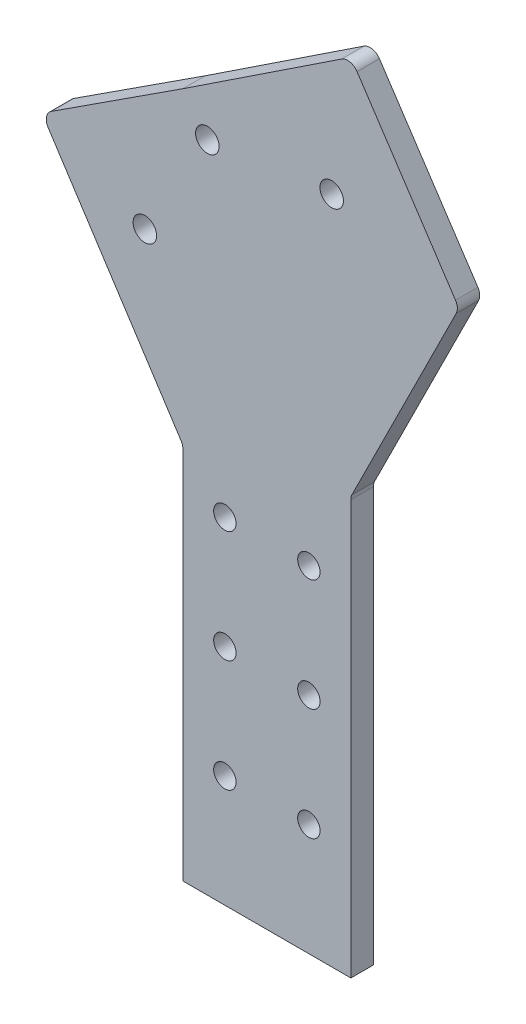
ISO-10303-21;
HEADER;
FILE_DESCRIPTION(('STEP AP214'),'2;1');
FILE_NAME('part.step','',(''),(''),'','','');
FILE_SCHEMA(('AUTOMOTIVE_DESIGN { 1 0 10303 214 1 1 1 1 }'));
ENDSEC;
DATA;
#1=APPLICATION_CONTEXT('core data for automotive mechanical design processes');
#2=APPLICATION_PROTOCOL_DEFINITION('international standard','automotive_design',2000,#1);
#3=PRODUCT_CONTEXT('',#1,'mechanical');
#4=PRODUCT('Part','Part','',(#3));
#5=PRODUCT_RELATED_PRODUCT_CATEGORY('part','',(#4));
#6=PRODUCT_DEFINITION_FORMATION('','',#4);
#7=PRODUCT_DEFINITION_CONTEXT('part definition',#1,'design');
#8=PRODUCT_DEFINITION('design','',#6,#7);
#9=PRODUCT_DEFINITION_SHAPE('','',#8);
#10=(LENGTH_UNIT() NAMED_UNIT(*) SI_UNIT(.MILLI.,.METRE.));
#11=(NAMED_UNIT(*) PLANE_ANGLE_UNIT() SI_UNIT($,.RADIAN.));
#12=(NAMED_UNIT(*) SI_UNIT($,.STERADIAN.) SOLID_ANGLE_UNIT());
#13=UNCERTAINTY_MEASURE_WITH_UNIT(LENGTH_MEASURE(1.E-05),#10,'distance_accuracy_value','');
#14=(GEOMETRIC_REPRESENTATION_CONTEXT(3) GLOBAL_UNCERTAINTY_ASSIGNED_CONTEXT((#13)) GLOBAL_UNIT_ASSIGNED_CONTEXT((#10,
#11,#12)) REPRESENTATION_CONTEXT('',''));
#15=CARTESIAN_POINT('',(0.,0.,0.));
#16=DIRECTION('',(0.,0.,1.));
#17=DIRECTION('',(1.,0.,0.));
#18=AXIS2_PLACEMENT_3D('',#15,#16,#17);
#19=CARTESIAN_POINT('',(-30.,-100.,4.));
#20=DIRECTION('',(1.,0.,0.));
#21=DIRECTION('',(0.,0.,-1.));
#22=AXIS2_PLACEMENT_3D('',#19,#20,#21);
#23=PLANE('',#22);
#24=DIRECTION('',(0.,-1.,0.));
#25=VECTOR('',#24,1.);
#26=CARTESIAN_POINT('',(-30.,-100.,4.));
#27=LINE('',#26,#25);
#28=CARTESIAN_POINT('',(-30.,-33.1570085491493,4.));
#29=VERTEX_POINT('',#28);
#30=CARTESIAN_POINT('',(-30.,-100.,4.));
#31=VERTEX_POINT('',#30);
#32=EDGE_CURVE('E147',#29,#31,#27,.T.);
#33=ORIENTED_EDGE('',*,*,#32,.F.);
#34=DIRECTION('',(0.,0.,1.));
#35=VECTOR('',#34,1.);
#36=CARTESIAN_POINT('',(-30.,-33.1570085491493,4.));
#37=LINE('',#36,#35);
#38=CARTESIAN_POINT('',(-30.,-33.1570085491493,0.));
#39=VERTEX_POINT('',#38);
#40=EDGE_CURVE('E251',#29,#39,#37,.F.);
#41=ORIENTED_EDGE('',*,*,#40,.T.);
#42=DIRECTION('',(0.,-1.,0.));
#43=VECTOR('',#42,1.);
#44=CARTESIAN_POINT('',(-30.,-100.,0.));
#45=LINE('',#44,#43);
#46=CARTESIAN_POINT('',(-30.,-100.,0.));
#47=VERTEX_POINT('',#46);
#48=EDGE_CURVE('E223',#39,#47,#45,.T.);
#49=ORIENTED_EDGE('',*,*,#48,.T.);
#50=DIRECTION('',(0.,0.,-1.));
#51=VECTOR('',#50,1.);
#52=CARTESIAN_POINT('',(-30.,-100.,4.));
#53=LINE('',#52,#51);
#54=EDGE_CURVE('E158',#31,#47,#53,.T.);
#55=ORIENTED_EDGE('',*,*,#54,.F.);
#56=EDGE_LOOP('',(#33,#41,#49,#55));
#57=FACE_BOUND('',#56,.T.);
#58=ADVANCED_FACE('F41',(#57),#23,.F.);
#59=CARTESIAN_POINT('',(-30.,22.5177722040746,4.));
#60=DIRECTION('',(0.551936985312062,-0.833885822067166,0.));
#61=DIRECTION('',(0.833885822067166,0.551936985312062,0.));
#62=AXIS2_PLACEMENT_3D('',#59,#60,#61);
#63=PLANE('',#62);
#64=DIRECTION('',(-0.833885822067166,-0.551936985312062,0.));
#65=VECTOR('',#64,1.);
#66=CARTESIAN_POINT('',(-30.,22.5177722040746,4.));
#67=LINE('',#66,#65);
#68=CARTESIAN_POINT('',(-1.66777164413434,41.2704650693214,4.));
#69=VERTEX_POINT('',#68);
#70=CARTESIAN_POINT('',(-30.,22.5177722040746,4.));
#71=VERTEX_POINT('',#70);
#72=EDGE_CURVE('E136',#69,#71,#67,.T.);
#73=ORIENTED_EDGE('',*,*,#72,.F.);
#74=DIRECTION('',(0.,0.,-1.));
#75=VECTOR('',#74,1.);
#76=CARTESIAN_POINT('',(-1.66777164413433,41.2704650693214,0.));
#77=LINE('',#76,#75);
#78=CARTESIAN_POINT('',(-1.66777164413434,41.2704650693214,0.));
#79=VERTEX_POINT('',#78);
#80=EDGE_CURVE('E267',#69,#79,#77,.T.);
#81=ORIENTED_EDGE('',*,*,#80,.T.);
#82=DIRECTION('',(-0.833885822067166,-0.551936985312062,0.));
#83=VECTOR('',#82,1.);
#84=CARTESIAN_POINT('',(-30.,22.5177722040746,0.));
#85=LINE('',#84,#83);
#86=CARTESIAN_POINT('',(-30.,22.5177722040746,0.));
#87=VERTEX_POINT('',#86);
#88=EDGE_CURVE('E153',#79,#87,#85,.T.);
#89=ORIENTED_EDGE('',*,*,#88,.T.);
#90=DIRECTION('',(0.,0.,-1.));
#91=VECTOR('',#90,1.);
#92=CARTESIAN_POINT('',(-30.,22.5177722040746,4.));
#93=LINE('',#92,#91);
#94=EDGE_CURVE('E151',#71,#87,#93,.T.);
#95=ORIENTED_EDGE('',*,*,#94,.F.);
#96=EDGE_LOOP('',(#73,#81,#89,#95));
#97=FACE_BOUND('',#96,.T.);
#98=ADVANCED_FACE('F152',(#97),#63,.F.);
#99=CARTESIAN_POINT('',(-30.,-100.,4.));
#100=DIRECTION('',(0.,1.,0.));
#101=DIRECTION('',(0.,0.,1.));
#102=AXIS2_PLACEMENT_3D('',#99,#100,#101);
#103=PLANE('',#102);
#104=DIRECTION('',(1.,0.,0.));
#105=VECTOR('',#104,1.);
#106=CARTESIAN_POINT('',(-30.,-100.,0.));
#107=LINE('',#106,#105);
#108=CARTESIAN_POINT('',(0.,-100.,0.));
#109=VERTEX_POINT('',#108);
#110=EDGE_CURVE('E225',#47,#109,#107,.T.);
#111=ORIENTED_EDGE('',*,*,#110,.T.);
#112=DIRECTION('',(0.,0.,-1.));
#113=VECTOR('',#112,1.);
#114=CARTESIAN_POINT('',(0.,-100.,4.));
#115=LINE('',#114,#113);
#116=CARTESIAN_POINT('',(0.,-100.,4.));
#117=VERTEX_POINT('',#116);
#118=EDGE_CURVE('E221',#117,#109,#115,.T.);
#119=ORIENTED_EDGE('',*,*,#118,.F.);
#120=DIRECTION('',(1.,0.,0.));
#121=VECTOR('',#120,1.);
#122=CARTESIAN_POINT('',(-30.,-100.,4.));
#123=LINE('',#122,#121);
#124=EDGE_CURVE('E218',#31,#117,#123,.T.);
#125=ORIENTED_EDGE('',*,*,#124,.F.);
#126=ORIENTED_EDGE('',*,*,#54,.T.);
#127=EDGE_LOOP('',(#111,#119,#125,#126));
#128=FACE_BOUND('',#127,.T.);
#129=ADVANCED_FACE('F309',(#128),#103,.F.);
#130=CARTESIAN_POINT('',(0.,-100.,4.));
#131=DIRECTION('',(-1.,0.,0.));
#132=DIRECTION('',(0.,0.,1.));
#133=AXIS2_PLACEMENT_3D('',#130,#131,#132);
#134=PLANE('',#133);
#135=DIRECTION('',(0.,1.,0.));
#136=VECTOR('',#135,1.);
#137=CARTESIAN_POINT('',(0.,-100.,0.));
#138=LINE('',#137,#136);
#139=CARTESIAN_POINT('',(0.,-26.0281038060491,0.));
#140=VERTEX_POINT('',#139);
#141=EDGE_CURVE('E215',#109,#140,#138,.T.);
#142=ORIENTED_EDGE('',*,*,#141,.T.);
#143=DIRECTION('',(0.,0.,1.));
#144=VECTOR('',#143,1.);
#145=CARTESIAN_POINT('',(0.,-26.0281038060491,4.));
#146=LINE('',#145,#144);
#147=CARTESIAN_POINT('',(0.,-26.0281038060491,4.));
#148=VERTEX_POINT('',#147);
#149=EDGE_CURVE('E157',#140,#148,#146,.T.);
#150=ORIENTED_EDGE('',*,*,#149,.T.);
#151=DIRECTION('',(0.,1.,0.));
#152=VECTOR('',#151,1.);
#153=CARTESIAN_POINT('',(0.,42.3743390399456,4.));
#154=LINE('',#153,#152);
#155=EDGE_CURVE('E148',#117,#148,#154,.T.);
#156=ORIENTED_EDGE('',*,*,#155,.F.);
#157=ORIENTED_EDGE('',*,*,#118,.T.);
#158=EDGE_LOOP('',(#142,#150,#156,#157));
#159=FACE_BOUND('',#158,.T.);
#160=ADVANCED_FACE('F331',(#159),#134,.F.);
#161=CARTESIAN_POINT('',(0.,0.,4.));
#162=DIRECTION('',(0.,0.,1.));
#163=DIRECTION('',(1.,0.,0.));
#164=AXIS2_PLACEMENT_3D('',#161,#162,#163);
#165=PLANE('',#164);
#166=CARTESIAN_POINT('',(-3.42993826182382,19.4978801372106,4.));
#167=DIRECTION('',(0.,0.,1.));
#168=DIRECTION('',(1.,0.,0.));
#169=AXIS2_PLACEMENT_3D('',#166,#167,#168);
#170=CIRCLE('',#169,2.10000000003924);
#171=CARTESIAN_POINT('',(-1.32993826178458,19.4978801372106,4.));
#172=VERTEX_POINT('',#171);
#173=EDGE_CURVE('E236',#172,#172,#170,.T.);
#174=ORIENTED_EDGE('',*,*,#173,.F.);
#175=EDGE_LOOP('',(#174));
#176=FACE_BOUND('',#175,.T.);
#177=CARTESIAN_POINT('',(-25.6270245562886,16.7979986516404,4.));
#178=DIRECTION('',(0.,0.,1.));
#179=DIRECTION('',(1.,0.,0.));
#180=AXIS2_PLACEMENT_3D('',#177,#178,#179);
#181=CIRCLE('',#180,2.10000000004027);
#182=CARTESIAN_POINT('',(-23.5270245562484,16.7979986516404,4.));
#183=VERTEX_POINT('',#182);
#184=EDGE_CURVE('E347',#183,#183,#181,.T.);
#185=ORIENTED_EDGE('',*,*,#184,.F.);
#186=EDGE_LOOP('',(#185));
#187=FACE_BOUND('',#186,.T.);
#188=CARTESIAN_POINT('',(-36.7853711445104,-2.57959927527192,4.));
#189=DIRECTION('',(0.,0.,1.));
#190=DIRECTION('',(1.,0.,0.));
#191=AXIS2_PLACEMENT_3D('',#188,#189,#190);
#192=CIRCLE('',#191,2.10000000003922);
#193=CARTESIAN_POINT('',(-34.6853711444712,-2.57959927527192,4.));
#194=VERTEX_POINT('',#193);
#195=EDGE_CURVE('E349',#194,#194,#192,.T.);
#196=ORIENTED_EDGE('',*,*,#195,.F.);
#197=EDGE_LOOP('',(#196));
#198=FACE_BOUND('',#197,.T.);
#199=CARTESIAN_POINT('',(-22.4999999999998,-60.,4.));
#200=DIRECTION('',(0.,0.,1.));
#201=DIRECTION('',(1.,0.,0.));
#202=AXIS2_PLACEMENT_3D('',#199,#200,#201);
#203=CIRCLE('',#202,2.);
#204=CARTESIAN_POINT('',(-20.4999999999998,-60.,4.));
#205=VERTEX_POINT('',#204);
#206=EDGE_CURVE('E189',#205,#205,#203,.T.);
#207=ORIENTED_EDGE('',*,*,#206,.F.);
#208=EDGE_LOOP('',(#207));
#209=FACE_BOUND('',#208,.T.);
#210=CARTESIAN_POINT('',(-7.49999999999959,-80.,4.));
#211=DIRECTION('',(0.,0.,1.));
#212=DIRECTION('',(1.,0.,0.));
#213=AXIS2_PLACEMENT_3D('',#210,#211,#212);
#214=CIRCLE('',#213,2.);
#215=CARTESIAN_POINT('',(-5.49999999999959,-80.,4.));
#216=VERTEX_POINT('',#215);
#217=EDGE_CURVE('E188',#216,#216,#214,.T.);
#218=ORIENTED_EDGE('',*,*,#217,.F.);
#219=EDGE_LOOP('',(#218));
#220=FACE_BOUND('',#219,.T.);
#221=CARTESIAN_POINT('',(-7.4999999999998,-60.,4.));
#222=DIRECTION('',(0.,0.,1.));
#223=DIRECTION('',(1.,0.,0.));
#224=AXIS2_PLACEMENT_3D('',#221,#222,#223);
#225=CIRCLE('',#224,2.);
#226=CARTESIAN_POINT('',(-5.49999999999979,-60.,4.));
#227=VERTEX_POINT('',#226);
#228=EDGE_CURVE('E201',#227,#227,#225,.T.);
#229=ORIENTED_EDGE('',*,*,#228,.F.);
#230=EDGE_LOOP('',(#229));
#231=FACE_BOUND('',#230,.T.);
#232=CARTESIAN_POINT('',(-7.50000000000001,-40.,4.));
#233=DIRECTION('',(0.,0.,1.));
#234=DIRECTION('',(1.,0.,0.));
#235=AXIS2_PLACEMENT_3D('',#232,#233,#234);
#236=CIRCLE('',#235,2.);
#237=CARTESIAN_POINT('',(-5.5,-40.,4.));
#238=VERTEX_POINT('',#237);
#239=EDGE_CURVE('E200',#238,#238,#236,.T.);
#240=ORIENTED_EDGE('',*,*,#239,.F.);
#241=EDGE_LOOP('',(#240));
#242=FACE_BOUND('',#241,.T.);
#243=CARTESIAN_POINT('',(-22.4999999999996,-80.,4.));
#244=DIRECTION('',(0.,0.,1.));
#245=DIRECTION('',(1.,0.,0.));
#246=AXIS2_PLACEMENT_3D('',#243,#244,#245);
#247=CIRCLE('',#246,2.);
#248=CARTESIAN_POINT('',(-20.4999999999996,-80.,4.));
#249=VERTEX_POINT('',#248);
#250=EDGE_CURVE('E181',#249,#249,#247,.T.);
#251=ORIENTED_EDGE('',*,*,#250,.F.);
#252=EDGE_LOOP('',(#251));
#253=FACE_BOUND('',#252,.T.);
#254=CARTESIAN_POINT('',(-22.5,-40.,4.));
#255=DIRECTION('',(0.,0.,1.));
#256=DIRECTION('',(1.,0.,0.));
#257=AXIS2_PLACEMENT_3D('',#254,#255,#256);
#258=CIRCLE('',#257,2.);
#259=CARTESIAN_POINT('',(-20.5,-40.,4.));
#260=VERTEX_POINT('',#259);
#261=EDGE_CURVE('E204',#260,#260,#258,.T.);
#262=ORIENTED_EDGE('',*,*,#261,.F.);
#263=EDGE_LOOP('',(#262));
#264=FACE_BOUND('',#263,.T.);
#265=DIRECTION('',(-0.838670567945423,-0.544639035015029,0.));
#266=VECTOR('',#265,1.);
#267=CARTESIAN_POINT('',(-30.,22.5177722040746,4.));
#268=LINE('',#267,#266);
#269=CARTESIAN_POINT('',(-53.4827759024718,7.2678792236538,4.));
#270=VERTEX_POINT('',#269);
#271=EDGE_CURVE('E140',#71,#270,#268,.T.);
#272=ORIENTED_EDGE('',*,*,#271,.T.);
#273=CARTESIAN_POINT('',(-52.3934978324418,5.59053808776296,4.));
#274=DIRECTION('',(0.,0.,1.));
#275=DIRECTION('',(1.,0.,0.));
#276=AXIS2_PLACEMENT_3D('',#273,#274,#275);
#277=CIRCLE('',#276,2.);
#278=CARTESIAN_POINT('',(-54.0708389683326,4.5012600177329,4.));
#279=VERTEX_POINT('',#278);
#280=EDGE_CURVE('E257',#270,#279,#277,.T.);
#281=ORIENTED_EDGE('',*,*,#280,.T.);
#282=DIRECTION('',(0.544639035015029,-0.838670567945423,0.));
#283=VECTOR('',#282,1.);
#284=CARTESIAN_POINT('',(-55.1601170383627,6.17860115362375,4.));
#285=LINE('',#284,#283);
#286=CARTESIAN_POINT('',(-30.3226588641091,-32.0677304791192,4.));
#287=VERTEX_POINT('',#286);
#288=EDGE_CURVE('E164',#279,#287,#285,.T.);
#289=ORIENTED_EDGE('',*,*,#288,.T.);
#290=CARTESIAN_POINT('',(-32.,-33.1570085491493,4.));
#291=DIRECTION('',(0.,0.,1.));
#292=DIRECTION('',(1.,0.,0.));
#293=AXIS2_PLACEMENT_3D('',#290,#291,#292);
#294=CIRCLE('',#293,2.);
#295=EDGE_CURVE('E49',#287,#29,#294,.F.);
#296=ORIENTED_EDGE('',*,*,#295,.T.);
#297=ORIENTED_EDGE('',*,*,#32,.T.);
#298=ORIENTED_EDGE('',*,*,#124,.T.);
#299=ORIENTED_EDGE('',*,*,#155,.T.);
#300=CARTESIAN_POINT('',(2.,-26.0281038060491,4.));
#301=DIRECTION('',(0.,0.,1.));
#302=DIRECTION('',(1.,0.,0.));
#303=AXIS2_PLACEMENT_3D('',#300,#301,#302);
#304=CIRCLE('',#303,2.);
#305=CARTESIAN_POINT('',(0.210131276795943,-25.1357081798295,4.));
#306=VERTEX_POINT('',#305);
#307=EDGE_CURVE('E269',#148,#306,#304,.F.);
#308=ORIENTED_EDGE('',*,*,#307,.T.);
#309=DIRECTION('',(0.446197813109806,0.894934361602026,0.));
#310=VECTOR('',#309,1.);
#311=CARTESIAN_POINT('',(19.3177944859222,13.1883352675948,4.));
#312=LINE('',#311,#310);
#313=CARTESIAN_POINT('',(18.8025696309006,12.1549540784388,4.));
#314=VERTEX_POINT('',#313);
#315=EDGE_CURVE('E336',#306,#314,#312,.T.);
#316=ORIENTED_EDGE('',*,*,#315,.T.);
#317=CARTESIAN_POINT('',(17.0127009076966,13.0473497046584,4.));
#318=DIRECTION('',(0.,0.,1.));
#319=DIRECTION('',(1.,0.,0.));
#320=AXIS2_PLACEMENT_3D('',#317,#318,#319);
#321=CIRCLE('',#320,2.);
#322=CARTESIAN_POINT('',(18.6804725518309,14.1512236752825,4.));
#323=VERTEX_POINT('',#322);
#324=EDGE_CURVE('E255',#314,#323,#321,.T.);
#325=ORIENTED_EDGE('',*,*,#324,.T.);
#326=DIRECTION('',(-0.551936985312062,0.833885822067165,0.));
#327=VECTOR('',#326,1.);
#328=CARTESIAN_POINT('',(0.,42.3743390399456,4.));
#329=LINE('',#328,#327);
#330=CARTESIAN_POINT('',(1.10387397062412,40.7065673958112,4.));
#331=VERTEX_POINT('',#330);
#332=EDGE_CURVE('E338',#323,#331,#329,.T.);
#333=ORIENTED_EDGE('',*,*,#332,.T.);
#334=CARTESIAN_POINT('',(-0.563897673510207,39.6026934251871,4.));
#335=DIRECTION('',(0.,0.,1.));
#336=DIRECTION('',(1.,0.,0.));
#337=AXIS2_PLACEMENT_3D('',#334,#335,#336);
#338=CIRCLE('',#337,2.);
#339=EDGE_CURVE('E143',#331,#69,#338,.T.);
#340=ORIENTED_EDGE('',*,*,#339,.T.);
#341=ORIENTED_EDGE('',*,*,#72,.T.);
#342=EDGE_LOOP('',(#272,#281,#289,#296,#297,#298,#299,#308,#316,#325,#333,#340,#341));
#343=FACE_BOUND('',#342,.T.);
#344=ADVANCED_FACE('F138',(#176,#187,#198,#209,#220,#231,#242,#253,#264,#343),#165,.T.);
#345=CARTESIAN_POINT('',(0.,0.,0.));
#346=DIRECTION('',(0.,0.,1.));
#347=DIRECTION('',(1.,0.,0.));
#348=AXIS2_PLACEMENT_3D('',#345,#346,#347);
#349=PLANE('',#348);
#350=CARTESIAN_POINT('',(-3.42993826182382,19.4978801372106,0.));
#351=DIRECTION('',(0.,0.,1.));
#352=DIRECTION('',(1.,0.,0.));
#353=AXIS2_PLACEMENT_3D('',#350,#351,#352);
#354=CIRCLE('',#353,2.10000000003924);
#355=CARTESIAN_POINT('',(-1.32993826178458,19.4978801372106,0.));
#356=VERTEX_POINT('',#355);
#357=EDGE_CURVE('E165',#356,#356,#354,.T.);
#358=ORIENTED_EDGE('',*,*,#357,.T.);
#359=EDGE_LOOP('',(#358));
#360=FACE_BOUND('',#359,.T.);
#361=CARTESIAN_POINT('',(-25.6270245562886,16.7979986516404,0.));
#362=DIRECTION('',(0.,0.,1.));
#363=DIRECTION('',(1.,0.,0.));
#364=AXIS2_PLACEMENT_3D('',#361,#362,#363);
#365=CIRCLE('',#364,2.10000000004027);
#366=CARTESIAN_POINT('',(-23.5270245562484,16.7979986516404,0.));
#367=VERTEX_POINT('',#366);
#368=EDGE_CURVE('E171',#367,#367,#365,.T.);
#369=ORIENTED_EDGE('',*,*,#368,.T.);
#370=EDGE_LOOP('',(#369));
#371=FACE_BOUND('',#370,.T.);
#372=CARTESIAN_POINT('',(-36.7853711445104,-2.57959927527192,0.));
#373=DIRECTION('',(0.,0.,1.));
#374=DIRECTION('',(1.,0.,0.));
#375=AXIS2_PLACEMENT_3D('',#372,#373,#374);
#376=CIRCLE('',#375,2.10000000003922);
#377=CARTESIAN_POINT('',(-34.6853711444712,-2.57959927527192,0.));
#378=VERTEX_POINT('',#377);
#379=EDGE_CURVE('E233',#378,#378,#376,.T.);
#380=ORIENTED_EDGE('',*,*,#379,.T.);
#381=EDGE_LOOP('',(#380));
#382=FACE_BOUND('',#381,.T.);
#383=CARTESIAN_POINT('',(-22.4999999999998,-60.,0.));
#384=DIRECTION('',(0.,0.,1.));
#385=DIRECTION('',(1.,0.,0.));
#386=AXIS2_PLACEMENT_3D('',#383,#384,#385);
#387=CIRCLE('',#386,2.);
#388=CARTESIAN_POINT('',(-20.4999999999998,-60.,0.));
#389=VERTEX_POINT('',#388);
#390=EDGE_CURVE('E184',#389,#389,#387,.F.);
#391=ORIENTED_EDGE('',*,*,#390,.F.);
#392=EDGE_LOOP('',(#391));
#393=FACE_BOUND('',#392,.T.);
#394=CARTESIAN_POINT('',(-7.49999999999959,-80.,0.));
#395=DIRECTION('',(0.,0.,1.));
#396=DIRECTION('',(1.,0.,0.));
#397=AXIS2_PLACEMENT_3D('',#394,#395,#396);
#398=CIRCLE('',#397,2.);
#399=CARTESIAN_POINT('',(-5.49999999999959,-80.,0.));
#400=VERTEX_POINT('',#399);
#401=EDGE_CURVE('E185',#400,#400,#398,.F.);
#402=ORIENTED_EDGE('',*,*,#401,.F.);
#403=EDGE_LOOP('',(#402));
#404=FACE_BOUND('',#403,.T.);
#405=CARTESIAN_POINT('',(-7.4999999999998,-60.,0.));
#406=DIRECTION('',(0.,0.,1.));
#407=DIRECTION('',(1.,0.,0.));
#408=AXIS2_PLACEMENT_3D('',#405,#406,#407);
#409=CIRCLE('',#408,2.);
#410=CARTESIAN_POINT('',(-5.49999999999979,-60.,0.));
#411=VERTEX_POINT('',#410);
#412=EDGE_CURVE('E192',#411,#411,#409,.F.);
#413=ORIENTED_EDGE('',*,*,#412,.F.);
#414=EDGE_LOOP('',(#413));
#415=FACE_BOUND('',#414,.T.);
#416=CARTESIAN_POINT('',(-7.50000000000001,-40.,0.));
#417=DIRECTION('',(0.,0.,1.));
#418=DIRECTION('',(1.,0.,0.));
#419=AXIS2_PLACEMENT_3D('',#416,#417,#418);
#420=CIRCLE('',#419,2.);
#421=CARTESIAN_POINT('',(-5.5,-40.,0.));
#422=VERTEX_POINT('',#421);
#423=EDGE_CURVE('E197',#422,#422,#420,.F.);
#424=ORIENTED_EDGE('',*,*,#423,.F.);
#425=EDGE_LOOP('',(#424));
#426=FACE_BOUND('',#425,.T.);
#427=CARTESIAN_POINT('',(-22.4999999999996,-80.,0.));
#428=DIRECTION('',(0.,0.,1.));
#429=DIRECTION('',(1.,0.,0.));
#430=AXIS2_PLACEMENT_3D('',#427,#428,#429);
#431=CIRCLE('',#430,2.);
#432=CARTESIAN_POINT('',(-20.4999999999996,-80.,0.));
#433=VERTEX_POINT('',#432);
#434=EDGE_CURVE('E178',#433,#433,#431,.F.);
#435=ORIENTED_EDGE('',*,*,#434,.F.);
#436=EDGE_LOOP('',(#435));
#437=FACE_BOUND('',#436,.T.);
#438=CARTESIAN_POINT('',(-22.5,-40.,0.));
#439=DIRECTION('',(0.,0.,1.));
#440=DIRECTION('',(1.,0.,0.));
#441=AXIS2_PLACEMENT_3D('',#438,#439,#440);
#442=CIRCLE('',#441,2.);
#443=CARTESIAN_POINT('',(-20.5,-40.,0.));
#444=VERTEX_POINT('',#443);
#445=EDGE_CURVE('E211',#444,#444,#442,.F.);
#446=ORIENTED_EDGE('',*,*,#445,.F.);
#447=EDGE_LOOP('',(#446));
#448=FACE_BOUND('',#447,.T.);
#449=DIRECTION('',(-0.544639035015029,0.838670567945423,0.));
#450=VECTOR('',#449,1.);
#451=CARTESIAN_POINT('',(-55.1601170383627,6.17860115362375,0.));
#452=LINE('',#451,#450);
#453=CARTESIAN_POINT('',(-30.3226588641091,-32.0677304791192,0.));
#454=VERTEX_POINT('',#453);
#455=CARTESIAN_POINT('',(-54.0708389683326,4.5012600177329,0.));
#456=VERTEX_POINT('',#455);
#457=EDGE_CURVE('E168',#454,#456,#452,.T.);
#458=ORIENTED_EDGE('',*,*,#457,.T.);
#459=CARTESIAN_POINT('',(-52.3934978324418,5.59053808776296,0.));
#460=DIRECTION('',(0.,0.,1.));
#461=DIRECTION('',(1.,0.,0.));
#462=AXIS2_PLACEMENT_3D('',#459,#460,#461);
#463=CIRCLE('',#462,2.);
#464=CARTESIAN_POINT('',(-53.4827759024718,7.2678792236538,0.));
#465=VERTEX_POINT('',#464);
#466=EDGE_CURVE('E262',#456,#465,#463,.F.);
#467=ORIENTED_EDGE('',*,*,#466,.T.);
#468=DIRECTION('',(0.838670567945423,0.544639035015029,0.));
#469=VECTOR('',#468,1.);
#470=CARTESIAN_POINT('',(-30.,22.5177722040746,0.));
#471=LINE('',#470,#469);
#472=EDGE_CURVE('E176',#465,#87,#471,.T.);
#473=ORIENTED_EDGE('',*,*,#472,.T.);
#474=ORIENTED_EDGE('',*,*,#88,.F.);
#475=CARTESIAN_POINT('',(-0.563897673510207,39.6026934251871,0.));
#476=DIRECTION('',(0.,0.,1.));
#477=DIRECTION('',(1.,0.,0.));
#478=AXIS2_PLACEMENT_3D('',#475,#476,#477);
#479=CIRCLE('',#478,2.);
#480=CARTESIAN_POINT('',(1.10387397062412,40.7065673958112,0.));
#481=VERTEX_POINT('',#480);
#482=EDGE_CURVE('E56',#79,#481,#479,.F.);
#483=ORIENTED_EDGE('',*,*,#482,.T.);
#484=DIRECTION('',(-0.551936985312062,0.833885822067165,0.));
#485=VECTOR('',#484,1.);
#486=CARTESIAN_POINT('',(0.,42.3743390399456,0.));
#487=LINE('',#486,#485);
#488=CARTESIAN_POINT('',(18.6804725518309,14.1512236752825,0.));
#489=VERTEX_POINT('',#488);
#490=EDGE_CURVE('E342',#489,#481,#487,.T.);
#491=ORIENTED_EDGE('',*,*,#490,.F.);
#492=CARTESIAN_POINT('',(17.0127009076966,13.0473497046584,0.));
#493=DIRECTION('',(0.,0.,1.));
#494=DIRECTION('',(1.,0.,0.));
#495=AXIS2_PLACEMENT_3D('',#492,#493,#494);
#496=CIRCLE('',#495,2.);
#497=CARTESIAN_POINT('',(18.8025696309006,12.1549540784388,0.));
#498=VERTEX_POINT('',#497);
#499=EDGE_CURVE('E260',#489,#498,#496,.F.);
#500=ORIENTED_EDGE('',*,*,#499,.T.);
#501=DIRECTION('',(0.446197813109806,0.894934361602026,0.));
#502=VECTOR('',#501,1.);
#503=CARTESIAN_POINT('',(19.3177944859222,13.1883352675948,0.));
#504=LINE('',#503,#502);
#505=CARTESIAN_POINT('',(0.210131276795943,-25.1357081798295,0.));
#506=VERTEX_POINT('',#505);
#507=EDGE_CURVE('E329',#506,#498,#504,.T.);
#508=ORIENTED_EDGE('',*,*,#507,.F.);
#509=CARTESIAN_POINT('',(2.,-26.0281038060491,0.));
#510=DIRECTION('',(0.,0.,1.));
#511=DIRECTION('',(1.,0.,0.));
#512=AXIS2_PLACEMENT_3D('',#509,#510,#511);
#513=CIRCLE('',#512,2.);
#514=EDGE_CURVE('E271',#506,#140,#513,.T.);
#515=ORIENTED_EDGE('',*,*,#514,.T.);
#516=ORIENTED_EDGE('',*,*,#141,.F.);
#517=ORIENTED_EDGE('',*,*,#110,.F.);
#518=ORIENTED_EDGE('',*,*,#48,.F.);
#519=CARTESIAN_POINT('',(-32.,-33.1570085491493,0.));
#520=DIRECTION('',(0.,0.,1.));
#521=DIRECTION('',(1.,0.,0.));
#522=AXIS2_PLACEMENT_3D('',#519,#520,#521);
#523=CIRCLE('',#522,2.);
#524=EDGE_CURVE('E11',#39,#454,#523,.T.);
#525=ORIENTED_EDGE('',*,*,#524,.T.);
#526=EDGE_LOOP('',(#458,#467,#473,#474,#483,#491,#500,#508,#515,#516,#517,#518,#525));
#527=FACE_BOUND('',#526,.T.);
#528=ADVANCED_FACE('F285',(#360,#371,#382,#393,#404,#415,#426,#437,#448,#527),#349,.F.);
#529=CARTESIAN_POINT('',(-22.5,-40.,-0.00100000000000013));
#530=DIRECTION('',(0.,0.,1.));
#531=DIRECTION('',(1.,0.,0.));
#532=AXIS2_PLACEMENT_3D('',#529,#530,#531);
#533=CYLINDRICAL_SURFACE('',#532,2.);
#534=ORIENTED_EDGE('',*,*,#261,.T.);
#535=EDGE_LOOP('',(#534));
#536=FACE_BOUND('',#535,.T.);
#537=ORIENTED_EDGE('',*,*,#445,.T.);
#538=EDGE_LOOP('',(#537));
#539=FACE_BOUND('',#538,.T.);
#540=ADVANCED_FACE('F405',(#536,#539),#533,.F.);
#541=CARTESIAN_POINT('',(-22.4999999999996,-80.,-0.00100000000000013));
#542=DIRECTION('',(0.,0.,1.));
#543=DIRECTION('',(1.,0.,0.));
#544=AXIS2_PLACEMENT_3D('',#541,#542,#543);
#545=CYLINDRICAL_SURFACE('',#544,2.);
#546=ORIENTED_EDGE('',*,*,#250,.T.);
#547=EDGE_LOOP('',(#546));
#548=FACE_BOUND('',#547,.T.);
#549=ORIENTED_EDGE('',*,*,#434,.T.);
#550=EDGE_LOOP('',(#549));
#551=FACE_BOUND('',#550,.T.);
#552=ADVANCED_FACE('F501',(#548,#551),#545,.F.);
#553=CARTESIAN_POINT('',(-7.50000000000001,-40.,-0.00100000000000013));
#554=DIRECTION('',(0.,0.,1.));
#555=DIRECTION('',(1.,0.,0.));
#556=AXIS2_PLACEMENT_3D('',#553,#554,#555);
#557=CYLINDRICAL_SURFACE('',#556,2.);
#558=ORIENTED_EDGE('',*,*,#239,.T.);
#559=EDGE_LOOP('',(#558));
#560=FACE_BOUND('',#559,.T.);
#561=ORIENTED_EDGE('',*,*,#423,.T.);
#562=EDGE_LOOP('',(#561));
#563=FACE_BOUND('',#562,.T.);
#564=ADVANCED_FACE('F492',(#560,#563),#557,.F.);
#565=CARTESIAN_POINT('',(-7.4999999999998,-60.,-0.00100000000000013));
#566=DIRECTION('',(0.,0.,1.));
#567=DIRECTION('',(1.,0.,0.));
#568=AXIS2_PLACEMENT_3D('',#565,#566,#567);
#569=CYLINDRICAL_SURFACE('',#568,2.);
#570=ORIENTED_EDGE('',*,*,#228,.T.);
#571=EDGE_LOOP('',(#570));
#572=FACE_BOUND('',#571,.T.);
#573=ORIENTED_EDGE('',*,*,#412,.T.);
#574=EDGE_LOOP('',(#573));
#575=FACE_BOUND('',#574,.T.);
#576=ADVANCED_FACE('F483',(#572,#575),#569,.F.);
#577=CARTESIAN_POINT('',(-7.49999999999959,-80.,-0.00100000000000013));
#578=DIRECTION('',(0.,0.,1.));
#579=DIRECTION('',(1.,0.,0.));
#580=AXIS2_PLACEMENT_3D('',#577,#578,#579);
#581=CYLINDRICAL_SURFACE('',#580,2.);
#582=ORIENTED_EDGE('',*,*,#217,.T.);
#583=EDGE_LOOP('',(#582));
#584=FACE_BOUND('',#583,.T.);
#585=ORIENTED_EDGE('',*,*,#401,.T.);
#586=EDGE_LOOP('',(#585));
#587=FACE_BOUND('',#586,.T.);
#588=ADVANCED_FACE('F474',(#584,#587),#581,.F.);
#589=CARTESIAN_POINT('',(-22.4999999999998,-60.,-0.00100000000000013));
#590=DIRECTION('',(0.,0.,1.));
#591=DIRECTION('',(1.,0.,0.));
#592=AXIS2_PLACEMENT_3D('',#589,#590,#591);
#593=CYLINDRICAL_SURFACE('',#592,2.);
#594=ORIENTED_EDGE('',*,*,#206,.T.);
#595=EDGE_LOOP('',(#594));
#596=FACE_BOUND('',#595,.T.);
#597=ORIENTED_EDGE('',*,*,#390,.T.);
#598=EDGE_LOOP('',(#597));
#599=FACE_BOUND('',#598,.T.);
#600=ADVANCED_FACE('F463',(#596,#599),#593,.F.);
#601=CARTESIAN_POINT('',(-55.1601170383627,6.17860115362375,-60.5565618697875));
#602=DIRECTION('',(-0.838670567945423,-0.544639035015029,0.));
#603=DIRECTION('',(0.544639035015029,-0.838670567945423,0.));
#604=AXIS2_PLACEMENT_3D('',#601,#602,#603);
#605=PLANE('',#604);
#606=ORIENTED_EDGE('',*,*,#457,.F.);
#607=DIRECTION('',(0.,0.,1.));
#608=VECTOR('',#607,1.);
#609=CARTESIAN_POINT('',(-30.3226588641091,-32.0677304791192,-60.5565618697875));
#610=LINE('',#609,#608);
#611=EDGE_CURVE('E248',#454,#287,#610,.T.);
#612=ORIENTED_EDGE('',*,*,#611,.T.);
#613=ORIENTED_EDGE('',*,*,#288,.F.);
#614=DIRECTION('',(0.,0.,1.));
#615=VECTOR('',#614,1.);
#616=CARTESIAN_POINT('',(-54.0708389683326,4.5012600177329,-60.5565618697875));
#617=LINE('',#616,#615);
#618=EDGE_CURVE('E246',#279,#456,#617,.F.);
#619=ORIENTED_EDGE('',*,*,#618,.T.);
#620=EDGE_LOOP('',(#606,#612,#613,#619));
#621=FACE_BOUND('',#620,.T.);
#622=ADVANCED_FACE('F289',(#621),#605,.T.);
#623=CARTESIAN_POINT('',(-30.,22.5177722040746,-60.5565618697875));
#624=DIRECTION('',(-0.544639035015029,0.838670567945423,0.));
#625=DIRECTION('',(-0.838670567945423,-0.544639035015029,0.));
#626=AXIS2_PLACEMENT_3D('',#623,#624,#625);
#627=PLANE('',#626);
#628=ORIENTED_EDGE('',*,*,#472,.F.);
#629=DIRECTION('',(0.,0.,1.));
#630=VECTOR('',#629,1.);
#631=CARTESIAN_POINT('',(-53.4827759024718,7.2678792236538,-60.5565618697875));
#632=LINE('',#631,#630);
#633=EDGE_CURVE('E163',#465,#270,#632,.T.);
#634=ORIENTED_EDGE('',*,*,#633,.T.);
#635=ORIENTED_EDGE('',*,*,#271,.F.);
#636=ORIENTED_EDGE('',*,*,#94,.T.);
#637=EDGE_LOOP('',(#628,#634,#635,#636));
#638=FACE_BOUND('',#637,.T.);
#639=ADVANCED_FACE('F161',(#638),#627,.T.);
#640=CARTESIAN_POINT('',(-36.7853711445104,-2.57959927527192,-6.));
#641=DIRECTION('',(0.,0.,1.));
#642=DIRECTION('',(1.,0.,0.));
#643=AXIS2_PLACEMENT_3D('',#640,#641,#642);
#644=CYLINDRICAL_SURFACE('',#643,2.10000000003922);
#645=ORIENTED_EDGE('',*,*,#195,.T.);
#646=EDGE_LOOP('',(#645));
#647=FACE_BOUND('',#646,.T.);
#648=ORIENTED_EDGE('',*,*,#379,.F.);
#649=EDGE_LOOP('',(#648));
#650=FACE_BOUND('',#649,.T.);
#651=ADVANCED_FACE('F440',(#647,#650),#644,.F.);
#652=CARTESIAN_POINT('',(-25.6270245562886,16.7979986516404,-6.));
#653=DIRECTION('',(0.,0.,1.));
#654=DIRECTION('',(1.,0.,0.));
#655=AXIS2_PLACEMENT_3D('',#652,#653,#654);
#656=CYLINDRICAL_SURFACE('',#655,2.10000000004027);
#657=ORIENTED_EDGE('',*,*,#184,.T.);
#658=EDGE_LOOP('',(#657));
#659=FACE_BOUND('',#658,.T.);
#660=ORIENTED_EDGE('',*,*,#368,.F.);
#661=EDGE_LOOP('',(#660));
#662=FACE_BOUND('',#661,.T.);
#663=ADVANCED_FACE('F430',(#659,#662),#656,.F.);
#664=CARTESIAN_POINT('',(-3.42993826182382,19.4978801372106,-6.));
#665=DIRECTION('',(0.,0.,1.));
#666=DIRECTION('',(1.,0.,0.));
#667=AXIS2_PLACEMENT_3D('',#664,#665,#666);
#668=CYLINDRICAL_SURFACE('',#667,2.10000000003924);
#669=ORIENTED_EDGE('',*,*,#173,.T.);
#670=EDGE_LOOP('',(#669));
#671=FACE_BOUND('',#670,.T.);
#672=ORIENTED_EDGE('',*,*,#357,.F.);
#673=EDGE_LOOP('',(#672));
#674=FACE_BOUND('',#673,.T.);
#675=ADVANCED_FACE('F394',(#671,#674),#668,.F.);
#676=CARTESIAN_POINT('',(0.,42.3743390399456,0.));
#677=DIRECTION('',(0.833885822067165,0.551936985312062,0.));
#678=DIRECTION('',(-0.551936985312062,0.833885822067165,0.));
#679=AXIS2_PLACEMENT_3D('',#676,#677,#678);
#680=PLANE('',#679);
#681=ORIENTED_EDGE('',*,*,#332,.F.);
#682=DIRECTION('',(0.,0.,1.));
#683=VECTOR('',#682,1.);
#684=CARTESIAN_POINT('',(18.6804725518309,14.1512236752825,0.));
#685=LINE('',#684,#683);
#686=EDGE_CURVE('E63',#323,#489,#685,.F.);
#687=ORIENTED_EDGE('',*,*,#686,.T.);
#688=ORIENTED_EDGE('',*,*,#490,.T.);
#689=DIRECTION('',(0.,0.,-1.));
#690=VECTOR('',#689,1.);
#691=CARTESIAN_POINT('',(1.10387397062412,40.7065673958112,4.));
#692=LINE('',#691,#690);
#693=EDGE_CURVE('E264',#481,#331,#692,.F.);
#694=ORIENTED_EDGE('',*,*,#693,.T.);
#695=EDGE_LOOP('',(#681,#687,#688,#694));
#696=FACE_BOUND('',#695,.T.);
#697=ADVANCED_FACE('F320',(#696),#680,.T.);
#698=CARTESIAN_POINT('',(19.3177944859222,13.1883352675948,0.));
#699=DIRECTION('',(0.894934361602026,-0.446197813109806,0.));
#700=DIRECTION('',(0.446197813109806,0.894934361602026,0.));
#701=AXIS2_PLACEMENT_3D('',#698,#699,#700);
#702=PLANE('',#701);
#703=ORIENTED_EDGE('',*,*,#315,.F.);
#704=DIRECTION('',(0.,0.,1.));
#705=VECTOR('',#704,1.);
#706=CARTESIAN_POINT('',(0.210131276795943,-25.1357081798295,0.));
#707=LINE('',#706,#705);
#708=EDGE_CURVE('E244',#306,#506,#707,.F.);
#709=ORIENTED_EDGE('',*,*,#708,.T.);
#710=ORIENTED_EDGE('',*,*,#507,.T.);
#711=DIRECTION('',(0.,0.,1.));
#712=VECTOR('',#711,1.);
#713=CARTESIAN_POINT('',(18.8025696309006,12.1549540784388,0.));
#714=LINE('',#713,#712);
#715=EDGE_CURVE('E241',#498,#314,#714,.T.);
#716=ORIENTED_EDGE('',*,*,#715,.T.);
#717=EDGE_LOOP('',(#703,#709,#710,#716));
#718=FACE_BOUND('',#717,.T.);
#719=ADVANCED_FACE('F315',(#718),#702,.T.);
#720=CARTESIAN_POINT('',(2.,-26.0281038060491,4.));
#721=DIRECTION('',(0.,0.,1.));
#722=DIRECTION('',(1.,0.,0.));
#723=AXIS2_PLACEMENT_3D('',#720,#721,#722);
#724=CYLINDRICAL_SURFACE('',#723,2.);
#725=ORIENTED_EDGE('',*,*,#514,.F.);
#726=ORIENTED_EDGE('',*,*,#708,.F.);
#727=ORIENTED_EDGE('',*,*,#307,.F.);
#728=ORIENTED_EDGE('',*,*,#149,.F.);
#729=EDGE_LOOP('',(#725,#726,#727,#728));
#730=FACE_BOUND('',#729,.T.);
#731=ADVANCED_FACE('F301',(#730),#724,.F.);
#732=CARTESIAN_POINT('',(-32.,-33.1570085491493,-60.5565618697875));
#733=DIRECTION('',(0.,0.,1.));
#734=DIRECTION('',(1.,0.,0.));
#735=AXIS2_PLACEMENT_3D('',#732,#733,#734);
#736=CYLINDRICAL_SURFACE('',#735,2.);
#737=ORIENTED_EDGE('',*,*,#524,.F.);
#738=ORIENTED_EDGE('',*,*,#40,.F.);
#739=ORIENTED_EDGE('',*,*,#295,.F.);
#740=ORIENTED_EDGE('',*,*,#611,.F.);
#741=EDGE_LOOP('',(#737,#738,#739,#740));
#742=FACE_BOUND('',#741,.T.);
#743=ADVANCED_FACE('F282',(#742),#736,.F.);
#744=CARTESIAN_POINT('',(-52.3934978324418,5.59053808776296,-60.5565618697875));
#745=DIRECTION('',(0.,0.,1.));
#746=DIRECTION('',(1.,0.,0.));
#747=AXIS2_PLACEMENT_3D('',#744,#745,#746);
#748=CYLINDRICAL_SURFACE('',#747,2.);
#749=ORIENTED_EDGE('',*,*,#466,.F.);
#750=ORIENTED_EDGE('',*,*,#618,.F.);
#751=ORIENTED_EDGE('',*,*,#280,.F.);
#752=ORIENTED_EDGE('',*,*,#633,.F.);
#753=EDGE_LOOP('',(#749,#750,#751,#752));
#754=FACE_BOUND('',#753,.T.);
#755=ADVANCED_FACE('F292',(#754),#748,.T.);
#756=CARTESIAN_POINT('',(17.0127009076966,13.0473497046584,0.));
#757=DIRECTION('',(0.,0.,1.));
#758=DIRECTION('',(1.,0.,0.));
#759=AXIS2_PLACEMENT_3D('',#756,#757,#758);
#760=CYLINDRICAL_SURFACE('',#759,2.);
#761=ORIENTED_EDGE('',*,*,#499,.F.);
#762=ORIENTED_EDGE('',*,*,#686,.F.);
#763=ORIENTED_EDGE('',*,*,#324,.F.);
#764=ORIENTED_EDGE('',*,*,#715,.F.);
#765=EDGE_LOOP('',(#761,#762,#763,#764));
#766=FACE_BOUND('',#765,.T.);
#767=ADVANCED_FACE('F294',(#766),#760,.T.);
#768=CARTESIAN_POINT('',(-0.563897673510207,39.6026934251871,4.));
#769=DIRECTION('',(0.,0.,1.));
#770=DIRECTION('',(1.,0.,0.));
#771=AXIS2_PLACEMENT_3D('',#768,#769,#770);
#772=CYLINDRICAL_SURFACE('',#771,2.);
#773=ORIENTED_EDGE('',*,*,#339,.F.);
#774=ORIENTED_EDGE('',*,*,#693,.F.);
#775=ORIENTED_EDGE('',*,*,#482,.F.);
#776=ORIENTED_EDGE('',*,*,#80,.F.);
#777=EDGE_LOOP('',(#773,#774,#775,#776));
#778=FACE_BOUND('',#777,.T.);
#779=ADVANCED_FACE('F43',(#778),#772,.T.);
#780=CLOSED_SHELL('',(#58,#98,#129,#160,#344,#528,#540,#552,#564,#576,#588,#600,#622,#639,#651,
#663,#675,#697,#719,#731,#743,#755,#767,#779));
#781=MANIFOLD_SOLID_BREP('B2',#780);
#782=ADVANCED_BREP_SHAPE_REPRESENTATION('',(#18,#781),#14);
#783=SHAPE_DEFINITION_REPRESENTATION(#9,#782);
ENDSEC;
END-ISO-10303-21;
